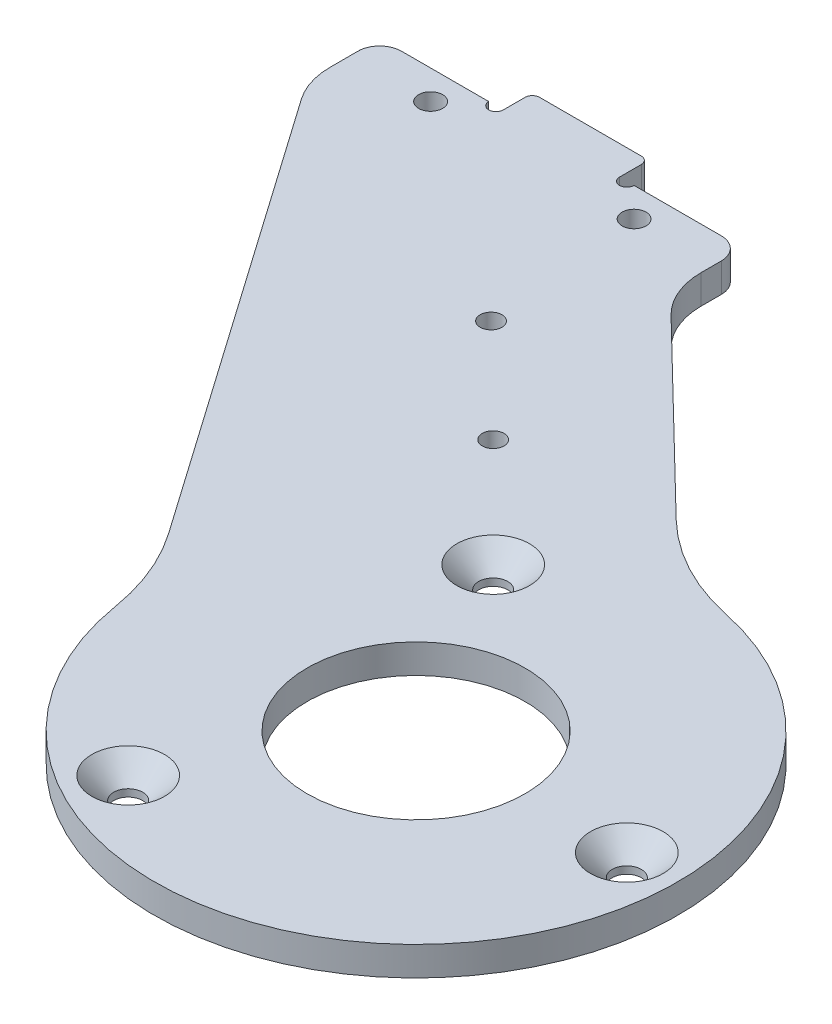
ISO-10303-21;
HEADER;
FILE_DESCRIPTION(('STEP AP214'),'2;1');
FILE_NAME('part.step','',(''),(''),'','','');
FILE_SCHEMA(('AUTOMOTIVE_DESIGN { 1 0 10303 214 1 1 1 1 }'));
ENDSEC;
DATA;
#1=APPLICATION_CONTEXT('core data for automotive mechanical design processes');
#2=APPLICATION_PROTOCOL_DEFINITION('international standard','automotive_design',2000,#1);
#3=PRODUCT_CONTEXT('',#1,'mechanical');
#4=PRODUCT('Part','Part','',(#3));
#5=PRODUCT_RELATED_PRODUCT_CATEGORY('part','',(#4));
#6=PRODUCT_DEFINITION_FORMATION('','',#4);
#7=PRODUCT_DEFINITION_CONTEXT('part definition',#1,'design');
#8=PRODUCT_DEFINITION('design','',#6,#7);
#9=PRODUCT_DEFINITION_SHAPE('','',#8);
#10=(LENGTH_UNIT() NAMED_UNIT(*) SI_UNIT(.MILLI.,.METRE.));
#11=(NAMED_UNIT(*) PLANE_ANGLE_UNIT() SI_UNIT($,.RADIAN.));
#12=(NAMED_UNIT(*) SI_UNIT($,.STERADIAN.) SOLID_ANGLE_UNIT());
#13=UNCERTAINTY_MEASURE_WITH_UNIT(LENGTH_MEASURE(1.E-05),#10,'distance_accuracy_value','');
#14=(GEOMETRIC_REPRESENTATION_CONTEXT(3) GLOBAL_UNCERTAINTY_ASSIGNED_CONTEXT((#13)) GLOBAL_UNIT_ASSIGNED_CONTEXT((#10,
#11,#12)) REPRESENTATION_CONTEXT('',''));
#15=CARTESIAN_POINT('',(0.,0.,0.));
#16=DIRECTION('',(0.,0.,1.));
#17=DIRECTION('',(1.,0.,0.));
#18=AXIS2_PLACEMENT_3D('',#15,#16,#17);
#19=CARTESIAN_POINT('',(-85.,4.,-80.));
#20=DIRECTION('',(0.,0.,1.));
#21=DIRECTION('',(1.,0.,0.));
#22=AXIS2_PLACEMENT_3D('',#19,#20,#21);
#23=PLANE('',#22);
#24=DIRECTION('',(-1.,0.,0.));
#25=VECTOR('',#24,1.);
#26=CARTESIAN_POINT('',(-85.,0.,-80.));
#27=LINE('',#26,#25);
#28=CARTESIAN_POINT('',(-38.,0.,-80.));
#29=VERTEX_POINT('',#28);
#30=CARTESIAN_POINT('',(-50.,0.,-80.));
#31=VERTEX_POINT('',#30);
#32=EDGE_CURVE('E199',#29,#31,#27,.T.);
#33=ORIENTED_EDGE('',*,*,#32,.T.);
#34=DIRECTION('',(0.,1.,0.));
#35=VECTOR('',#34,1.);
#36=CARTESIAN_POINT('',(-50.,0.,-80.));
#37=LINE('',#36,#35);
#38=CARTESIAN_POINT('',(-50.,4.,-80.));
#39=VERTEX_POINT('',#38);
#40=EDGE_CURVE('E183',#31,#39,#37,.T.);
#41=ORIENTED_EDGE('',*,*,#40,.T.);
#42=DIRECTION('',(-1.,0.,0.));
#43=VECTOR('',#42,1.);
#44=CARTESIAN_POINT('',(-85.,4.,-80.));
#45=LINE('',#44,#43);
#46=CARTESIAN_POINT('',(-38.,4.,-80.));
#47=VERTEX_POINT('',#46);
#48=EDGE_CURVE('E223',#47,#39,#45,.T.);
#49=ORIENTED_EDGE('',*,*,#48,.F.);
#50=DIRECTION('',(0.,-1.,0.));
#51=VECTOR('',#50,1.);
#52=CARTESIAN_POINT('',(-38.,4.,-80.));
#53=LINE('',#52,#51);
#54=EDGE_CURVE('E205',#47,#29,#53,.T.);
#55=ORIENTED_EDGE('',*,*,#54,.T.);
#56=EDGE_LOOP('',(#33,#41,#49,#55));
#57=FACE_BOUND('',#56,.T.);
#58=ADVANCED_FACE('F40',(#57),#23,.F.);
#59=CARTESIAN_POINT('',(-85.,4.,-80.));
#60=DIRECTION('',(1.,0.,0.));
#61=DIRECTION('',(0.,0.,-1.));
#62=AXIS2_PLACEMENT_3D('',#59,#60,#61);
#63=PLANE('',#62);
#64=DIRECTION('',(0.,0.,1.));
#65=VECTOR('',#64,1.);
#66=CARTESIAN_POINT('',(-85.,4.,-80.));
#67=LINE('',#66,#65);
#68=CARTESIAN_POINT('',(-85.,4.,-77.));
#69=VERTEX_POINT('',#68);
#70=CARTESIAN_POINT('',(-85.,4.,-73.152222308191));
#71=VERTEX_POINT('',#70);
#72=EDGE_CURVE('E207',#69,#71,#67,.T.);
#73=ORIENTED_EDGE('',*,*,#72,.F.);
#74=DIRECTION('',(0.,-1.,0.));
#75=VECTOR('',#74,1.);
#76=CARTESIAN_POINT('',(-85.,4.,-77.));
#77=LINE('',#76,#75);
#78=CARTESIAN_POINT('',(-85.,0.,-77.));
#79=VERTEX_POINT('',#78);
#80=EDGE_CURVE('E277',#69,#79,#77,.T.);
#81=ORIENTED_EDGE('',*,*,#80,.T.);
#82=DIRECTION('',(0.,0.,1.));
#83=VECTOR('',#82,1.);
#84=CARTESIAN_POINT('',(-85.,0.,-80.));
#85=LINE('',#84,#83);
#86=CARTESIAN_POINT('',(-85.,0.,-73.152222308191));
#87=VERTEX_POINT('',#86);
#88=EDGE_CURVE('E427',#79,#87,#85,.T.);
#89=ORIENTED_EDGE('',*,*,#88,.T.);
#90=DIRECTION('',(0.,-1.,0.));
#91=VECTOR('',#90,1.);
#92=CARTESIAN_POINT('',(-85.,4.,-73.152222308191));
#93=LINE('',#92,#91);
#94=EDGE_CURVE('E257',#87,#71,#93,.F.);
#95=ORIENTED_EDGE('',*,*,#94,.T.);
#96=EDGE_LOOP('',(#73,#81,#89,#95));
#97=FACE_BOUND('',#96,.T.);
#98=ADVANCED_FACE('F511',(#97),#63,.F.);
#99=CARTESIAN_POINT('',(-85.,4.,-70.));
#100=DIRECTION('',(0.81923192051904,0.,-0.573462344363329));
#101=DIRECTION('',(-0.573462344363329,0.,-0.81923192051904));
#102=AXIS2_PLACEMENT_3D('',#99,#100,#101);
#103=PLANE('',#102);
#104=DIRECTION('',(0.573462344363329,0.,0.81923192051904));
#105=VECTOR('',#104,1.);
#106=CARTESIAN_POINT('',(-85.,4.,-70.));
#107=LINE('',#106,#105);
#108=CARTESIAN_POINT('',(-83.1923192051904,4.,-67.4175988645577));
#109=VERTEX_POINT('',#108);
#110=CARTESIAN_POINT('',(-40.5490624094028,4.,-6.49866058486115));
#111=VERTEX_POINT('',#110);
#112=EDGE_CURVE('E212',#109,#111,#107,.T.);
#113=ORIENTED_EDGE('',*,*,#112,.F.);
#114=DIRECTION('',(0.,-1.,0.));
#115=VECTOR('',#114,1.);
#116=CARTESIAN_POINT('',(-83.1923192051904,4.,-67.4175988645577));
#117=LINE('',#116,#115);
#118=CARTESIAN_POINT('',(-83.1923192051904,0.,-67.4175988645577));
#119=VERTEX_POINT('',#118);
#120=EDGE_CURVE('E249',#109,#119,#117,.T.);
#121=ORIENTED_EDGE('',*,*,#120,.T.);
#122=DIRECTION('',(0.573462344363329,0.,0.81923192051904));
#123=VECTOR('',#122,1.);
#124=CARTESIAN_POINT('',(-85.,0.,-70.));
#125=LINE('',#124,#123);
#126=CARTESIAN_POINT('',(-40.5490624094028,0.,-6.49866058486115));
#127=VERTEX_POINT('',#126);
#128=EDGE_CURVE('E457',#119,#127,#125,.T.);
#129=ORIENTED_EDGE('',*,*,#128,.T.);
#130=DIRECTION('',(0.,1.,0.));
#131=VECTOR('',#130,1.);
#132=CARTESIAN_POINT('',(-40.5490624094028,4.,-6.49866058486117));
#133=LINE('',#132,#131);
#134=EDGE_CURVE('E238',#127,#111,#133,.T.);
#135=ORIENTED_EDGE('',*,*,#134,.T.);
#136=EDGE_LOOP('',(#113,#121,#129,#135));
#137=FACE_BOUND('',#136,.T.);
#138=ADVANCED_FACE('F504',(#137),#103,.F.);
#139=CARTESIAN_POINT('',(0.,4.,0.));
#140=DIRECTION('',(0.,-1.,0.));
#141=DIRECTION('',(0.,0.,-1.));
#142=AXIS2_PLACEMENT_3D('',#139,#140,#141);
#143=CYLINDRICAL_SURFACE('',#142,36.);
#144=CARTESIAN_POINT('',(0.,4.,0.));
#145=DIRECTION('',(0.,1.,0.));
#146=DIRECTION('',(0.,0.,1.));
#147=AXIS2_PLACEMENT_3D('',#144,#145,#146);
#148=CIRCLE('',#147,36.);
#149=CARTESIAN_POINT('',(-35.5232836499858,4.,5.83920531602111));
#150=VERTEX_POINT('',#149);
#151=CARTESIAN_POINT('',(7.43947496595859,4.,-35.2229216878849));
#152=VERTEX_POINT('',#151);
#153=EDGE_CURVE('E441',#150,#152,#148,.T.);
#154=ORIENTED_EDGE('',*,*,#153,.F.);
#155=DIRECTION('',(0.,-1.,0.));
#156=VECTOR('',#155,1.);
#157=CARTESIAN_POINT('',(-35.5232836499858,4.,5.83920531602111));
#158=LINE('',#157,#156);
#159=CARTESIAN_POINT('',(-35.5232836499858,0.,5.83920531602111));
#160=VERTEX_POINT('',#159);
#161=EDGE_CURVE('E234',#150,#160,#158,.T.);
#162=ORIENTED_EDGE('',*,*,#161,.T.);
#163=CARTESIAN_POINT('',(0.,0.,0.));
#164=DIRECTION('',(0.,1.,0.));
#165=DIRECTION('',(0.,0.,1.));
#166=AXIS2_PLACEMENT_3D('',#163,#164,#165);
#167=CIRCLE('',#166,36.);
#168=CARTESIAN_POINT('',(7.43947496595859,0.,-35.2229216878849));
#169=VERTEX_POINT('',#168);
#170=EDGE_CURVE('E460',#160,#169,#167,.T.);
#171=ORIENTED_EDGE('',*,*,#170,.T.);
#172=DIRECTION('',(0.,-1.,0.));
#173=VECTOR('',#172,1.);
#174=CARTESIAN_POINT('',(7.43947496595859,4.,-35.2229216878849));
#175=LINE('',#174,#173);
#176=EDGE_CURVE('E222',#169,#152,#175,.F.);
#177=ORIENTED_EDGE('',*,*,#176,.T.);
#178=EDGE_LOOP('',(#154,#162,#171,#177));
#179=FACE_BOUND('',#178,.T.);
#180=ADVANCED_FACE('F493',(#179),#143,.T.);
#181=CARTESIAN_POINT('',(0.,4.,-36.));
#182=DIRECTION('',(-0.696785684263249,0.,0.717279380859227));
#183=DIRECTION('',(0.717279380859227,0.,0.696785684263249));
#184=AXIS2_PLACEMENT_3D('',#181,#182,#183);
#185=PLANE('',#184);
#186=DIRECTION('',(-0.717279380859227,0.,-0.696785684263249));
#187=VECTOR('',#186,1.);
#188=CARTESIAN_POINT('',(0.,0.,-36.));
#189=LINE('',#188,#187);
#190=CARTESIAN_POINT('',(-7.26453309030673,0.,-43.0569750020123));
#191=VERTEX_POINT('',#190);
#192=CARTESIAN_POINT('',(-31.9678568426325,0.,-67.0544895042715));
#193=VERTEX_POINT('',#192);
#194=EDGE_CURVE('E462',#191,#193,#189,.T.);
#195=ORIENTED_EDGE('',*,*,#194,.T.);
#196=DIRECTION('',(0.,-1.,0.));
#197=VECTOR('',#196,1.);
#198=CARTESIAN_POINT('',(-31.9678568426325,4.,-67.0544895042715));
#199=LINE('',#198,#197);
#200=CARTESIAN_POINT('',(-31.9678568426325,4.,-67.0544895042715));
#201=VERTEX_POINT('',#200);
#202=EDGE_CURVE('E268',#193,#201,#199,.F.);
#203=ORIENTED_EDGE('',*,*,#202,.T.);
#204=DIRECTION('',(-0.717279380859227,0.,-0.696785684263249));
#205=VECTOR('',#204,1.);
#206=CARTESIAN_POINT('',(0.,4.,-36.));
#207=LINE('',#206,#205);
#208=CARTESIAN_POINT('',(-7.26453309030673,4.,-43.0569750020123));
#209=VERTEX_POINT('',#208);
#210=EDGE_CURVE('E444',#209,#201,#207,.T.);
#211=ORIENTED_EDGE('',*,*,#210,.F.);
#212=DIRECTION('',(0.,1.,0.));
#213=VECTOR('',#212,1.);
#214=CARTESIAN_POINT('',(-7.26453309030673,0.,-43.0569750020123));
#215=LINE('',#214,#213);
#216=EDGE_CURVE('E218',#209,#191,#215,.F.);
#217=ORIENTED_EDGE('',*,*,#216,.T.);
#218=EDGE_LOOP('',(#195,#203,#211,#217));
#219=FACE_BOUND('',#218,.T.);
#220=ADVANCED_FACE('F567',(#219),#185,.F.);
#221=CARTESIAN_POINT('',(-35.,4.,-80.));
#222=DIRECTION('',(-1.,0.,0.));
#223=DIRECTION('',(0.,0.,1.));
#224=AXIS2_PLACEMENT_3D('',#221,#222,#223);
#225=PLANE('',#224);
#226=DIRECTION('',(0.,0.,-1.));
#227=VECTOR('',#226,1.);
#228=CARTESIAN_POINT('',(-35.,0.,-80.));
#229=LINE('',#228,#227);
#230=CARTESIAN_POINT('',(-35.,0.,-74.2272833128638));
#231=VERTEX_POINT('',#230);
#232=CARTESIAN_POINT('',(-35.,0.,-77.));
#233=VERTEX_POINT('',#232);
#234=EDGE_CURVE('E214',#231,#233,#229,.T.);
#235=ORIENTED_EDGE('',*,*,#234,.T.);
#236=DIRECTION('',(0.,-1.,0.));
#237=VECTOR('',#236,1.);
#238=CARTESIAN_POINT('',(-35.,4.,-77.));
#239=LINE('',#238,#237);
#240=CARTESIAN_POINT('',(-35.,4.,-77.));
#241=VERTEX_POINT('',#240);
#242=EDGE_CURVE('E300',#233,#241,#239,.F.);
#243=ORIENTED_EDGE('',*,*,#242,.T.);
#244=DIRECTION('',(0.,0.,-1.));
#245=VECTOR('',#244,1.);
#246=CARTESIAN_POINT('',(-35.,4.,-80.));
#247=LINE('',#246,#245);
#248=CARTESIAN_POINT('',(-35.,4.,-74.2272833128638));
#249=VERTEX_POINT('',#248);
#250=EDGE_CURVE('E448',#249,#241,#247,.T.);
#251=ORIENTED_EDGE('',*,*,#250,.F.);
#252=DIRECTION('',(0.,-1.,0.));
#253=VECTOR('',#252,1.);
#254=CARTESIAN_POINT('',(-35.,0.,-74.2272833128638));
#255=LINE('',#254,#253);
#256=EDGE_CURVE('E264',#249,#231,#255,.T.);
#257=ORIENTED_EDGE('',*,*,#256,.T.);
#258=EDGE_LOOP('',(#235,#243,#251,#257));
#259=FACE_BOUND('',#258,.T.);
#260=ADVANCED_FACE('F473',(#259),#225,.F.);
#261=CARTESIAN_POINT('',(-70.,4.,-80.));
#262=VERTEX_POINT('',#261);
#263=CARTESIAN_POINT('',(-82.,4.,-80.));
#264=VERTEX_POINT('',#263);
#265=EDGE_CURVE('E452',#262,#264,#45,.T.);
#266=ORIENTED_EDGE('',*,*,#265,.F.);
#267=DIRECTION('',(0.,1.,0.));
#268=VECTOR('',#267,1.);
#269=CARTESIAN_POINT('',(-70.,0.,-80.));
#270=LINE('',#269,#268);
#271=CARTESIAN_POINT('',(-70.,0.,-80.));
#272=VERTEX_POINT('',#271);
#273=EDGE_CURVE('E385',#272,#262,#270,.T.);
#274=ORIENTED_EDGE('',*,*,#273,.F.);
#275=CARTESIAN_POINT('',(-82.,0.,-80.));
#276=VERTEX_POINT('',#275);
#277=EDGE_CURVE('E208',#272,#276,#27,.T.);
#278=ORIENTED_EDGE('',*,*,#277,.T.);
#279=DIRECTION('',(0.,-1.,0.));
#280=VECTOR('',#279,1.);
#281=CARTESIAN_POINT('',(-82.,4.,-80.));
#282=LINE('',#281,#280);
#283=EDGE_CURVE('E290',#276,#264,#282,.F.);
#284=ORIENTED_EDGE('',*,*,#283,.T.);
#285=EDGE_LOOP('',(#266,#274,#278,#284));
#286=FACE_BOUND('',#285,.T.);
#287=ADVANCED_FACE('F520',(#286),#23,.F.);
#288=CARTESIAN_POINT('',(0.,4.,0.));
#289=DIRECTION('',(0.,1.,0.));
#290=DIRECTION('',(0.,0.,1.));
#291=AXIS2_PLACEMENT_3D('',#288,#289,#290);
#292=PLANE('',#291);
#293=CARTESIAN_POINT('',(-43.6868805879241,4.,-54.0042263577252));
#294=DIRECTION('',(0.,1.,0.));
#295=DIRECTION('',(0.,0.,1.));
#296=AXIS2_PLACEMENT_3D('',#293,#294,#295);
#297=CIRCLE('',#296,1.5);
#298=CARTESIAN_POINT('',(-43.6868805879241,4.,-52.5042263577252));
#299=VERTEX_POINT('',#298);
#300=EDGE_CURVE('E354',#299,#299,#297,.T.);
#301=ORIENTED_EDGE('',*,*,#300,.F.);
#302=EDGE_LOOP('',(#301));
#303=FACE_BOUND('',#302,.T.);
#304=CARTESIAN_POINT('',(-29.4011663022099,4.,-40.0071421132499));
#305=DIRECTION('',(0.,1.,0.));
#306=DIRECTION('',(0.,0.,1.));
#307=AXIS2_PLACEMENT_3D('',#304,#305,#306);
#308=CIRCLE('',#307,1.5);
#309=CARTESIAN_POINT('',(-29.4011663022099,4.,-38.5071421132499));
#310=VERTEX_POINT('',#309);
#311=EDGE_CURVE('E362',#310,#310,#308,.T.);
#312=ORIENTED_EDGE('',*,*,#311,.F.);
#313=EDGE_LOOP('',(#312));
#314=FACE_BOUND('',#313,.T.);
#315=CARTESIAN_POINT('',(-14.4999999999998,4.,25.1147367097489));
#316=DIRECTION('',(0.,1.,0.));
#317=DIRECTION('',(0.,0.,1.));
#318=AXIS2_PLACEMENT_3D('',#315,#316,#317);
#319=CIRCLE('',#318,4.99999999999999);
#320=CARTESIAN_POINT('',(-14.4999999999998,4.,30.1147367097488));
#321=VERTEX_POINT('',#320);
#322=EDGE_CURVE('E345',#321,#321,#319,.F.);
#323=ORIENTED_EDGE('',*,*,#322,.T.);
#324=EDGE_LOOP('',(#323));
#325=FACE_BOUND('',#324,.T.);
#326=CARTESIAN_POINT('',(29.,4.,0.));
#327=DIRECTION('',(0.,1.,0.));
#328=DIRECTION('',(0.,0.,1.));
#329=AXIS2_PLACEMENT_3D('',#326,#327,#328);
#330=CIRCLE('',#329,4.99999999999999);
#331=CARTESIAN_POINT('',(29.,4.,4.99999999999999));
#332=VERTEX_POINT('',#331);
#333=EDGE_CURVE('E341',#332,#332,#330,.F.);
#334=ORIENTED_EDGE('',*,*,#333,.T.);
#335=EDGE_LOOP('',(#334));
#336=FACE_BOUND('',#335,.T.);
#337=CARTESIAN_POINT('',(-14.5000000000001,4.,-25.1147367097486));
#338=DIRECTION('',(0.,1.,0.));
#339=DIRECTION('',(0.,0.,1.));
#340=AXIS2_PLACEMENT_3D('',#337,#338,#339);
#341=CIRCLE('',#340,4.99999999999999);
#342=CARTESIAN_POINT('',(-14.5000000000001,4.,-20.1147367097487));
#343=VERTEX_POINT('',#342);
#344=EDGE_CURVE('E337',#343,#343,#341,.F.);
#345=ORIENTED_EDGE('',*,*,#344,.T.);
#346=EDGE_LOOP('',(#345));
#347=FACE_BOUND('',#346,.T.);
#348=CARTESIAN_POINT('',(0.,4.,0.));
#349=DIRECTION('',(0.,1.,0.));
#350=DIRECTION('',(0.,0.,1.));
#351=AXIS2_PLACEMENT_3D('',#348,#349,#350);
#352=CIRCLE('',#351,15.);
#353=CARTESIAN_POINT('',(0.,4.,15.));
#354=VERTEX_POINT('',#353);
#355=EDGE_CURVE('E333',#354,#354,#352,.T.);
#356=ORIENTED_EDGE('',*,*,#355,.F.);
#357=EDGE_LOOP('',(#356));
#358=FACE_BOUND('',#357,.T.);
#359=DIRECTION('',(-1.,0.,0.));
#360=VECTOR('',#359,1.);
#361=CARTESIAN_POINT('',(-68.,4.,-84.));
#362=LINE('',#361,#360);
#363=CARTESIAN_POINT('',(-53.,4.,-84.));
#364=VERTEX_POINT('',#363);
#365=CARTESIAN_POINT('',(-67.,4.,-84.));
#366=VERTEX_POINT('',#365);
#367=EDGE_CURVE('E410',#364,#366,#362,.T.);
#368=ORIENTED_EDGE('',*,*,#367,.T.);
#369=CARTESIAN_POINT('',(-67.,4.,-83.));
#370=DIRECTION('',(0.,1.,0.));
#371=DIRECTION('',(0.,0.,1.));
#372=AXIS2_PLACEMENT_3D('',#369,#370,#371);
#373=CIRCLE('',#372,1.);
#374=CARTESIAN_POINT('',(-68.,4.,-83.));
#375=VERTEX_POINT('',#374);
#376=EDGE_CURVE('E313',#366,#375,#373,.T.);
#377=ORIENTED_EDGE('',*,*,#376,.T.);
#378=DIRECTION('',(0.,0.,1.));
#379=VECTOR('',#378,1.);
#380=CARTESIAN_POINT('',(-68.,4.,-84.));
#381=LINE('',#380,#379);
#382=CARTESIAN_POINT('',(-68.,4.,-80.));
#383=VERTEX_POINT('',#382);
#384=EDGE_CURVE('E399',#375,#383,#381,.T.);
#385=ORIENTED_EDGE('',*,*,#384,.T.);
#386=CARTESIAN_POINT('',(-69.,4.,-80.));
#387=DIRECTION('',(0.,1.,0.));
#388=DIRECTION('',(0.,0.,-1.));
#389=AXIS2_PLACEMENT_3D('',#386,#387,#388);
#390=CIRCLE('',#389,1.);
#391=EDGE_CURVE('E332',#262,#383,#390,.T.);
#392=ORIENTED_EDGE('',*,*,#391,.F.);
#393=ORIENTED_EDGE('',*,*,#265,.T.);
#394=CARTESIAN_POINT('',(-82.,4.,-77.));
#395=DIRECTION('',(0.,1.,0.));
#396=DIRECTION('',(0.,0.,1.));
#397=AXIS2_PLACEMENT_3D('',#394,#395,#396);
#398=CIRCLE('',#397,3.);
#399=EDGE_CURVE('E297',#264,#69,#398,.T.);
#400=ORIENTED_EDGE('',*,*,#399,.T.);
#401=ORIENTED_EDGE('',*,*,#72,.T.);
#402=CARTESIAN_POINT('',(-75.,4.,-73.152222308191));
#403=DIRECTION('',(0.,1.,0.));
#404=DIRECTION('',(0.,0.,1.));
#405=AXIS2_PLACEMENT_3D('',#402,#403,#404);
#406=CIRCLE('',#405,10.);
#407=EDGE_CURVE('E261',#71,#109,#406,.T.);
#408=ORIENTED_EDGE('',*,*,#407,.T.);
#409=ORIENTED_EDGE('',*,*,#112,.T.);
#410=CARTESIAN_POINT('',(-65.126020024974,4.,10.7052097460387));
#411=DIRECTION('',(0.,1.,0.));
#412=DIRECTION('',(0.,0.,1.));
#413=AXIS2_PLACEMENT_3D('',#410,#411,#412);
#414=CIRCLE('',#413,30.);
#415=EDGE_CURVE('E246',#111,#150,#414,.F.);
#416=ORIENTED_EDGE('',*,*,#415,.T.);
#417=ORIENTED_EDGE('',*,*,#153,.T.);
#418=CARTESIAN_POINT('',(13.6390374375907,4.,-64.5753564277891));
#419=DIRECTION('',(0.,1.,0.));
#420=DIRECTION('',(0.,0.,1.));
#421=AXIS2_PLACEMENT_3D('',#418,#419,#420);
#422=CIRCLE('',#421,30.);
#423=EDGE_CURVE('E231',#152,#209,#422,.F.);
#424=ORIENTED_EDGE('',*,*,#423,.T.);
#425=ORIENTED_EDGE('',*,*,#210,.T.);
#426=CARTESIAN_POINT('',(-25.,4.,-74.2272833128638));
#427=DIRECTION('',(0.,1.,0.));
#428=DIRECTION('',(0.,0.,1.));
#429=AXIS2_PLACEMENT_3D('',#426,#427,#428);
#430=CIRCLE('',#429,10.);
#431=EDGE_CURVE('E274',#201,#249,#430,.F.);
#432=ORIENTED_EDGE('',*,*,#431,.T.);
#433=ORIENTED_EDGE('',*,*,#250,.T.);
#434=CARTESIAN_POINT('',(-38.,4.,-77.));
#435=DIRECTION('',(0.,1.,0.));
#436=DIRECTION('',(0.,0.,1.));
#437=AXIS2_PLACEMENT_3D('',#434,#435,#436);
#438=CIRCLE('',#437,3.);
#439=EDGE_CURVE('E294',#241,#47,#438,.T.);
#440=ORIENTED_EDGE('',*,*,#439,.T.);
#441=ORIENTED_EDGE('',*,*,#48,.T.);
#442=CARTESIAN_POINT('',(-51.,4.,-80.));
#443=DIRECTION('',(0.,1.,0.));
#444=DIRECTION('',(0.,0.,1.));
#445=AXIS2_PLACEMENT_3D('',#442,#443,#444);
#446=CIRCLE('',#445,1.);
#447=CARTESIAN_POINT('',(-52.,4.,-80.));
#448=VERTEX_POINT('',#447);
#449=EDGE_CURVE('E189',#448,#39,#446,.T.);
#450=ORIENTED_EDGE('',*,*,#449,.F.);
#451=DIRECTION('',(0.,0.,-1.));
#452=VECTOR('',#451,1.);
#453=CARTESIAN_POINT('',(-52.,4.,-84.));
#454=LINE('',#453,#452);
#455=CARTESIAN_POINT('',(-52.,4.,-83.));
#456=VERTEX_POINT('',#455);
#457=EDGE_CURVE('E195',#448,#456,#454,.T.);
#458=ORIENTED_EDGE('',*,*,#457,.T.);
#459=CARTESIAN_POINT('',(-53.,4.,-83.));
#460=DIRECTION('',(0.,1.,0.));
#461=DIRECTION('',(0.,0.,1.));
#462=AXIS2_PLACEMENT_3D('',#459,#460,#461);
#463=CIRCLE('',#462,1.);
#464=EDGE_CURVE('E310',#456,#364,#463,.T.);
#465=ORIENTED_EDGE('',*,*,#464,.T.);
#466=EDGE_LOOP('',(#368,#377,#385,#392,#393,#400,#401,#408,#409,#416,#417,#424,#425,#432,#433,
#440,#441,#450,#458,#465));
#467=FACE_BOUND('',#466,.T.);
#468=CARTESIAN_POINT('',(-46.,4.,-76.));
#469=DIRECTION('',(0.,1.,0.));
#470=DIRECTION('',(0.,0.,1.));
#471=AXIS2_PLACEMENT_3D('',#468,#469,#470);
#472=CIRCLE('',#471,1.65);
#473=CARTESIAN_POINT('',(-46.,4.,-74.35));
#474=VERTEX_POINT('',#473);
#475=EDGE_CURVE('E428',#474,#474,#472,.T.);
#476=ORIENTED_EDGE('',*,*,#475,.F.);
#477=EDGE_LOOP('',(#476));
#478=FACE_BOUND('',#477,.T.);
#479=CARTESIAN_POINT('',(-74.,4.,-76.));
#480=DIRECTION('',(0.,1.,0.));
#481=DIRECTION('',(0.,0.,-1.));
#482=AXIS2_PLACEMENT_3D('',#479,#480,#481);
#483=CIRCLE('',#482,1.65);
#484=CARTESIAN_POINT('',(-74.,4.,-77.65));
#485=VERTEX_POINT('',#484);
#486=EDGE_CURVE('E419',#485,#485,#483,.T.);
#487=ORIENTED_EDGE('',*,*,#486,.F.);
#488=EDGE_LOOP('',(#487));
#489=FACE_BOUND('',#488,.T.);
#490=ADVANCED_FACE('F480',(#303,#314,#325,#336,#347,#358,#467,#478,#489),#292,.T.);
#491=CARTESIAN_POINT('',(0.,0.,0.));
#492=DIRECTION('',(0.,1.,0.));
#493=DIRECTION('',(0.,0.,1.));
#494=AXIS2_PLACEMENT_3D('',#491,#492,#493);
#495=PLANE('',#494);
#496=CARTESIAN_POINT('',(-43.6868805879241,0.,-54.0042263577252));
#497=DIRECTION('',(0.,1.,0.));
#498=DIRECTION('',(0.,0.,1.));
#499=AXIS2_PLACEMENT_3D('',#496,#497,#498);
#500=CIRCLE('',#499,1.5);
#501=CARTESIAN_POINT('',(-43.6868805879241,0.,-52.5042263577252));
#502=VERTEX_POINT('',#501);
#503=EDGE_CURVE('E45',#502,#502,#500,.T.);
#504=ORIENTED_EDGE('',*,*,#503,.T.);
#505=EDGE_LOOP('',(#504));
#506=FACE_BOUND('',#505,.T.);
#507=CARTESIAN_POINT('',(-29.4011663022099,0.,-40.0071421132499));
#508=DIRECTION('',(0.,1.,0.));
#509=DIRECTION('',(0.,0.,1.));
#510=AXIS2_PLACEMENT_3D('',#507,#508,#509);
#511=CIRCLE('',#510,1.5);
#512=CARTESIAN_POINT('',(-29.4011663022099,0.,-38.5071421132499));
#513=VERTEX_POINT('',#512);
#514=EDGE_CURVE('E351',#513,#513,#511,.T.);
#515=ORIENTED_EDGE('',*,*,#514,.T.);
#516=EDGE_LOOP('',(#515));
#517=FACE_BOUND('',#516,.T.);
#518=CARTESIAN_POINT('',(29.,0.,0.));
#519=DIRECTION('',(0.,-1.,0.));
#520=DIRECTION('',(0.,0.,-1.));
#521=AXIS2_PLACEMENT_3D('',#518,#519,#520);
#522=CIRCLE('',#521,2.);
#523=CARTESIAN_POINT('',(29.,0.,-2.));
#524=VERTEX_POINT('',#523);
#525=EDGE_CURVE('E370',#524,#524,#522,.T.);
#526=ORIENTED_EDGE('',*,*,#525,.F.);
#527=EDGE_LOOP('',(#526));
#528=FACE_BOUND('',#527,.T.);
#529=CARTESIAN_POINT('',(-14.5000000000001,0.,-25.1147367097486));
#530=DIRECTION('',(0.,-1.,0.));
#531=DIRECTION('',(0.,0.,-1.));
#532=AXIS2_PLACEMENT_3D('',#529,#530,#531);
#533=CIRCLE('',#532,2.);
#534=CARTESIAN_POINT('',(-14.5000000000001,0.,-27.1147367097486));
#535=VERTEX_POINT('',#534);
#536=EDGE_CURVE('E374',#535,#535,#533,.T.);
#537=ORIENTED_EDGE('',*,*,#536,.F.);
#538=EDGE_LOOP('',(#537));
#539=FACE_BOUND('',#538,.T.);
#540=CARTESIAN_POINT('',(-14.4999999999998,0.,25.1147367097489));
#541=DIRECTION('',(0.,-1.,0.));
#542=DIRECTION('',(0.,0.,-1.));
#543=AXIS2_PLACEMENT_3D('',#540,#541,#542);
#544=CIRCLE('',#543,2.);
#545=CARTESIAN_POINT('',(-14.4999999999998,0.,23.1147367097489));
#546=VERTEX_POINT('',#545);
#547=EDGE_CURVE('E360',#546,#546,#544,.T.);
#548=ORIENTED_EDGE('',*,*,#547,.F.);
#549=EDGE_LOOP('',(#548));
#550=FACE_BOUND('',#549,.T.);
#551=CARTESIAN_POINT('',(0.,0.,0.));
#552=DIRECTION('',(0.,1.,0.));
#553=DIRECTION('',(0.,0.,1.));
#554=AXIS2_PLACEMENT_3D('',#551,#552,#553);
#555=CIRCLE('',#554,15.);
#556=CARTESIAN_POINT('',(0.,0.,15.));
#557=VERTEX_POINT('',#556);
#558=EDGE_CURVE('E328',#557,#557,#555,.T.);
#559=ORIENTED_EDGE('',*,*,#558,.T.);
#560=EDGE_LOOP('',(#559));
#561=FACE_BOUND('',#560,.T.);
#562=CARTESIAN_POINT('',(-46.,0.,-76.));
#563=DIRECTION('',(0.,1.,0.));
#564=DIRECTION('',(0.,0.,1.));
#565=AXIS2_PLACEMENT_3D('',#562,#563,#564);
#566=CIRCLE('',#565,1.65);
#567=CARTESIAN_POINT('',(-46.,0.,-74.35));
#568=VERTEX_POINT('',#567);
#569=EDGE_CURVE('E423',#568,#568,#566,.T.);
#570=ORIENTED_EDGE('',*,*,#569,.T.);
#571=EDGE_LOOP('',(#570));
#572=FACE_BOUND('',#571,.T.);
#573=CARTESIAN_POINT('',(-74.,0.,-76.));
#574=DIRECTION('',(0.,1.,0.));
#575=DIRECTION('',(0.,0.,-1.));
#576=AXIS2_PLACEMENT_3D('',#573,#574,#575);
#577=CIRCLE('',#576,1.65);
#578=CARTESIAN_POINT('',(-74.,0.,-77.65));
#579=VERTEX_POINT('',#578);
#580=EDGE_CURVE('E432',#579,#579,#577,.T.);
#581=ORIENTED_EDGE('',*,*,#580,.T.);
#582=EDGE_LOOP('',(#581));
#583=FACE_BOUND('',#582,.T.);
#584=DIRECTION('',(0.,0.,1.));
#585=VECTOR('',#584,1.);
#586=CARTESIAN_POINT('',(-68.,0.,-84.));
#587=LINE('',#586,#585);
#588=CARTESIAN_POINT('',(-68.,0.,-83.));
#589=VERTEX_POINT('',#588);
#590=CARTESIAN_POINT('',(-68.,0.,-80.));
#591=VERTEX_POINT('',#590);
#592=EDGE_CURVE('E403',#589,#591,#587,.T.);
#593=ORIENTED_EDGE('',*,*,#592,.F.);
#594=CARTESIAN_POINT('',(-67.,0.,-83.));
#595=DIRECTION('',(0.,1.,0.));
#596=DIRECTION('',(0.,0.,1.));
#597=AXIS2_PLACEMENT_3D('',#594,#595,#596);
#598=CIRCLE('',#597,1.);
#599=CARTESIAN_POINT('',(-67.,0.,-84.));
#600=VERTEX_POINT('',#599);
#601=EDGE_CURVE('E320',#589,#600,#598,.F.);
#602=ORIENTED_EDGE('',*,*,#601,.T.);
#603=DIRECTION('',(-1.,0.,0.));
#604=VECTOR('',#603,1.);
#605=CARTESIAN_POINT('',(-68.,0.,-84.));
#606=LINE('',#605,#604);
#607=CARTESIAN_POINT('',(-53.,0.,-84.));
#608=VERTEX_POINT('',#607);
#609=EDGE_CURVE('E398',#608,#600,#606,.T.);
#610=ORIENTED_EDGE('',*,*,#609,.F.);
#611=CARTESIAN_POINT('',(-53.,0.,-83.));
#612=DIRECTION('',(0.,1.,0.));
#613=DIRECTION('',(0.,0.,1.));
#614=AXIS2_PLACEMENT_3D('',#611,#612,#613);
#615=CIRCLE('',#614,1.);
#616=CARTESIAN_POINT('',(-52.,0.,-83.));
#617=VERTEX_POINT('',#616);
#618=EDGE_CURVE('E59',#608,#617,#615,.F.);
#619=ORIENTED_EDGE('',*,*,#618,.T.);
#620=DIRECTION('',(0.,0.,-1.));
#621=VECTOR('',#620,1.);
#622=CARTESIAN_POINT('',(-52.,0.,-84.));
#623=LINE('',#622,#621);
#624=CARTESIAN_POINT('',(-52.,0.,-80.));
#625=VERTEX_POINT('',#624);
#626=EDGE_CURVE('E200',#625,#617,#623,.T.);
#627=ORIENTED_EDGE('',*,*,#626,.F.);
#628=CARTESIAN_POINT('',(-51.,0.,-80.));
#629=DIRECTION('',(0.,1.,0.));
#630=DIRECTION('',(0.,0.,1.));
#631=AXIS2_PLACEMENT_3D('',#628,#629,#630);
#632=CIRCLE('',#631,1.);
#633=EDGE_CURVE('E186',#625,#31,#632,.T.);
#634=ORIENTED_EDGE('',*,*,#633,.T.);
#635=ORIENTED_EDGE('',*,*,#32,.F.);
#636=CARTESIAN_POINT('',(-38.,0.,-77.));
#637=DIRECTION('',(0.,1.,0.));
#638=DIRECTION('',(0.,0.,1.));
#639=AXIS2_PLACEMENT_3D('',#636,#637,#638);
#640=CIRCLE('',#639,3.);
#641=EDGE_CURVE('E281',#29,#233,#640,.F.);
#642=ORIENTED_EDGE('',*,*,#641,.T.);
#643=ORIENTED_EDGE('',*,*,#234,.F.);
#644=CARTESIAN_POINT('',(-25.,0.,-74.2272833128638));
#645=DIRECTION('',(0.,1.,0.));
#646=DIRECTION('',(0.,0.,1.));
#647=AXIS2_PLACEMENT_3D('',#644,#645,#646);
#648=CIRCLE('',#647,10.);
#649=EDGE_CURVE('E271',#231,#193,#648,.T.);
#650=ORIENTED_EDGE('',*,*,#649,.T.);
#651=ORIENTED_EDGE('',*,*,#194,.F.);
#652=CARTESIAN_POINT('',(13.6390374375907,0.,-64.5753564277891));
#653=DIRECTION('',(0.,1.,0.));
#654=DIRECTION('',(0.,0.,1.));
#655=AXIS2_PLACEMENT_3D('',#652,#653,#654);
#656=CIRCLE('',#655,30.);
#657=EDGE_CURVE('E227',#191,#169,#656,.T.);
#658=ORIENTED_EDGE('',*,*,#657,.T.);
#659=ORIENTED_EDGE('',*,*,#170,.F.);
#660=CARTESIAN_POINT('',(-65.126020024974,0.,10.7052097460387));
#661=DIRECTION('',(0.,1.,0.));
#662=DIRECTION('',(0.,0.,1.));
#663=AXIS2_PLACEMENT_3D('',#660,#661,#662);
#664=CIRCLE('',#663,30.);
#665=EDGE_CURVE('E242',#160,#127,#664,.T.);
#666=ORIENTED_EDGE('',*,*,#665,.T.);
#667=ORIENTED_EDGE('',*,*,#128,.F.);
#668=CARTESIAN_POINT('',(-75.,0.,-73.152222308191));
#669=DIRECTION('',(0.,1.,0.));
#670=DIRECTION('',(0.,0.,1.));
#671=AXIS2_PLACEMENT_3D('',#668,#669,#670);
#672=CIRCLE('',#671,10.);
#673=EDGE_CURVE('E253',#119,#87,#672,.F.);
#674=ORIENTED_EDGE('',*,*,#673,.T.);
#675=ORIENTED_EDGE('',*,*,#88,.F.);
#676=CARTESIAN_POINT('',(-82.,0.,-77.));
#677=DIRECTION('',(0.,1.,0.));
#678=DIRECTION('',(0.,0.,1.));
#679=AXIS2_PLACEMENT_3D('',#676,#677,#678);
#680=CIRCLE('',#679,3.);
#681=EDGE_CURVE('E284',#79,#276,#680,.F.);
#682=ORIENTED_EDGE('',*,*,#681,.T.);
#683=ORIENTED_EDGE('',*,*,#277,.F.);
#684=CARTESIAN_POINT('',(-69.,0.,-80.));
#685=DIRECTION('',(0.,1.,0.));
#686=DIRECTION('',(0.,0.,-1.));
#687=AXIS2_PLACEMENT_3D('',#684,#685,#686);
#688=CIRCLE('',#687,1.);
#689=EDGE_CURVE('E387',#272,#591,#688,.T.);
#690=ORIENTED_EDGE('',*,*,#689,.T.);
#691=EDGE_LOOP('',(#593,#602,#610,#619,#627,#634,#635,#642,#643,#650,#651,#658,#659,#666,#667,
#674,#675,#682,#683,#690));
#692=FACE_BOUND('',#691,.T.);
#693=ADVANCED_FACE('F198',(#506,#517,#528,#539,#550,#561,#572,#583,#692),#495,.F.);
#694=CARTESIAN_POINT('',(13.6390374375907,4.,-64.5753564277891));
#695=DIRECTION('',(0.,-1.,0.));
#696=DIRECTION('',(0.,0.,-1.));
#697=AXIS2_PLACEMENT_3D('',#694,#695,#696);
#698=CYLINDRICAL_SURFACE('',#697,30.);
#699=ORIENTED_EDGE('',*,*,#423,.F.);
#700=ORIENTED_EDGE('',*,*,#176,.F.);
#701=ORIENTED_EDGE('',*,*,#657,.F.);
#702=ORIENTED_EDGE('',*,*,#216,.F.);
#703=EDGE_LOOP('',(#699,#700,#701,#702));
#704=FACE_BOUND('',#703,.T.);
#705=ADVANCED_FACE('F490',(#704),#698,.F.);
#706=CARTESIAN_POINT('',(-65.126020024974,4.,10.7052097460387));
#707=DIRECTION('',(0.,-1.,0.));
#708=DIRECTION('',(0.,0.,-1.));
#709=AXIS2_PLACEMENT_3D('',#706,#707,#708);
#710=CYLINDRICAL_SURFACE('',#709,30.);
#711=ORIENTED_EDGE('',*,*,#415,.F.);
#712=ORIENTED_EDGE('',*,*,#134,.F.);
#713=ORIENTED_EDGE('',*,*,#665,.F.);
#714=ORIENTED_EDGE('',*,*,#161,.F.);
#715=EDGE_LOOP('',(#711,#712,#713,#714));
#716=FACE_BOUND('',#715,.T.);
#717=ADVANCED_FACE('F497',(#716),#710,.F.);
#718=CARTESIAN_POINT('',(-74.,0.,-76.));
#719=DIRECTION('',(0.,1.,0.));
#720=DIRECTION('',(0.,0.,1.));
#721=AXIS2_PLACEMENT_3D('',#718,#719,#720);
#722=CYLINDRICAL_SURFACE('',#721,1.65);
#723=ORIENTED_EDGE('',*,*,#580,.F.);
#724=EDGE_LOOP('',(#723));
#725=FACE_BOUND('',#724,.T.);
#726=ORIENTED_EDGE('',*,*,#486,.T.);
#727=EDGE_LOOP('',(#726));
#728=FACE_BOUND('',#727,.T.);
#729=ADVANCED_FACE('F581',(#725,#728),#722,.F.);
#730=CARTESIAN_POINT('',(-46.,0.,-76.));
#731=DIRECTION('',(0.,1.,0.));
#732=DIRECTION('',(0.,0.,1.));
#733=AXIS2_PLACEMENT_3D('',#730,#731,#732);
#734=CYLINDRICAL_SURFACE('',#733,1.65);
#735=ORIENTED_EDGE('',*,*,#569,.F.);
#736=EDGE_LOOP('',(#735));
#737=FACE_BOUND('',#736,.T.);
#738=ORIENTED_EDGE('',*,*,#475,.T.);
#739=EDGE_LOOP('',(#738));
#740=FACE_BOUND('',#739,.T.);
#741=ADVANCED_FACE('F584',(#737,#740),#734,.F.);
#742=CARTESIAN_POINT('',(-75.,4.,-73.152222308191));
#743=DIRECTION('',(0.,-1.,0.));
#744=DIRECTION('',(0.,0.,-1.));
#745=AXIS2_PLACEMENT_3D('',#742,#743,#744);
#746=CYLINDRICAL_SURFACE('',#745,10.);
#747=ORIENTED_EDGE('',*,*,#407,.F.);
#748=ORIENTED_EDGE('',*,*,#94,.F.);
#749=ORIENTED_EDGE('',*,*,#673,.F.);
#750=ORIENTED_EDGE('',*,*,#120,.F.);
#751=EDGE_LOOP('',(#747,#748,#749,#750));
#752=FACE_BOUND('',#751,.T.);
#753=ADVANCED_FACE('F508',(#752),#746,.T.);
#754=CARTESIAN_POINT('',(-25.,4.,-74.2272833128638));
#755=DIRECTION('',(0.,1.,0.));
#756=DIRECTION('',(0.,0.,1.));
#757=AXIS2_PLACEMENT_3D('',#754,#755,#756);
#758=CYLINDRICAL_SURFACE('',#757,10.);
#759=ORIENTED_EDGE('',*,*,#431,.F.);
#760=ORIENTED_EDGE('',*,*,#202,.F.);
#761=ORIENTED_EDGE('',*,*,#649,.F.);
#762=ORIENTED_EDGE('',*,*,#256,.F.);
#763=EDGE_LOOP('',(#759,#760,#761,#762));
#764=FACE_BOUND('',#763,.T.);
#765=ADVANCED_FACE('F484',(#764),#758,.F.);
#766=CARTESIAN_POINT('',(-82.,4.,-77.));
#767=DIRECTION('',(0.,-1.,0.));
#768=DIRECTION('',(0.,0.,-1.));
#769=AXIS2_PLACEMENT_3D('',#766,#767,#768);
#770=CYLINDRICAL_SURFACE('',#769,3.);
#771=ORIENTED_EDGE('',*,*,#399,.F.);
#772=ORIENTED_EDGE('',*,*,#283,.F.);
#773=ORIENTED_EDGE('',*,*,#681,.F.);
#774=ORIENTED_EDGE('',*,*,#80,.F.);
#775=EDGE_LOOP('',(#771,#772,#773,#774));
#776=FACE_BOUND('',#775,.T.);
#777=ADVANCED_FACE('F517',(#776),#770,.T.);
#778=CARTESIAN_POINT('',(-38.,4.,-77.));
#779=DIRECTION('',(0.,-1.,0.));
#780=DIRECTION('',(0.,0.,-1.));
#781=AXIS2_PLACEMENT_3D('',#778,#779,#780);
#782=CYLINDRICAL_SURFACE('',#781,3.);
#783=ORIENTED_EDGE('',*,*,#439,.F.);
#784=ORIENTED_EDGE('',*,*,#242,.F.);
#785=ORIENTED_EDGE('',*,*,#641,.F.);
#786=ORIENTED_EDGE('',*,*,#54,.F.);
#787=EDGE_LOOP('',(#783,#784,#785,#786));
#788=FACE_BOUND('',#787,.T.);
#789=ADVANCED_FACE('F478',(#788),#782,.T.);
#790=CARTESIAN_POINT('',(-52.,0.,-84.));
#791=DIRECTION('',(1.,0.,0.));
#792=DIRECTION('',(0.,0.,-1.));
#793=AXIS2_PLACEMENT_3D('',#790,#791,#792);
#794=PLANE('',#793);
#795=ORIENTED_EDGE('',*,*,#626,.T.);
#796=DIRECTION('',(0.,1.,0.));
#797=VECTOR('',#796,1.);
#798=CARTESIAN_POINT('',(-52.,0.,-83.));
#799=LINE('',#798,#797);
#800=EDGE_CURVE('E323',#617,#456,#799,.T.);
#801=ORIENTED_EDGE('',*,*,#800,.T.);
#802=ORIENTED_EDGE('',*,*,#457,.F.);
#803=DIRECTION('',(0.,1.,0.));
#804=VECTOR('',#803,1.);
#805=CARTESIAN_POINT('',(-52.,0.,-80.));
#806=LINE('',#805,#804);
#807=EDGE_CURVE('E416',#625,#448,#806,.T.);
#808=ORIENTED_EDGE('',*,*,#807,.F.);
#809=EDGE_LOOP('',(#795,#801,#802,#808));
#810=FACE_BOUND('',#809,.T.);
#811=ADVANCED_FACE('F540',(#810),#794,.T.);
#812=CARTESIAN_POINT('',(-68.,0.,-84.));
#813=DIRECTION('',(-1.,0.,0.));
#814=DIRECTION('',(0.,0.,1.));
#815=AXIS2_PLACEMENT_3D('',#812,#813,#814);
#816=PLANE('',#815);
#817=ORIENTED_EDGE('',*,*,#384,.F.);
#818=DIRECTION('',(0.,1.,0.));
#819=VECTOR('',#818,1.);
#820=CARTESIAN_POINT('',(-68.,0.,-83.));
#821=LINE('',#820,#819);
#822=EDGE_CURVE('E67',#375,#589,#821,.F.);
#823=ORIENTED_EDGE('',*,*,#822,.T.);
#824=ORIENTED_EDGE('',*,*,#592,.T.);
#825=DIRECTION('',(0.,1.,0.));
#826=VECTOR('',#825,1.);
#827=CARTESIAN_POINT('',(-68.,0.,-80.));
#828=LINE('',#827,#826);
#829=EDGE_CURVE('E406',#591,#383,#828,.T.);
#830=ORIENTED_EDGE('',*,*,#829,.T.);
#831=EDGE_LOOP('',(#817,#823,#824,#830));
#832=FACE_BOUND('',#831,.T.);
#833=ADVANCED_FACE('F526',(#832),#816,.T.);
#834=CARTESIAN_POINT('',(-68.,0.,-84.));
#835=DIRECTION('',(0.,0.,-1.));
#836=DIRECTION('',(-1.,0.,0.));
#837=AXIS2_PLACEMENT_3D('',#834,#835,#836);
#838=PLANE('',#837);
#839=ORIENTED_EDGE('',*,*,#609,.T.);
#840=DIRECTION('',(0.,1.,0.));
#841=VECTOR('',#840,1.);
#842=CARTESIAN_POINT('',(-67.,0.,-84.));
#843=LINE('',#842,#841);
#844=EDGE_CURVE('E306',#600,#366,#843,.T.);
#845=ORIENTED_EDGE('',*,*,#844,.T.);
#846=ORIENTED_EDGE('',*,*,#367,.F.);
#847=DIRECTION('',(0.,1.,0.));
#848=VECTOR('',#847,1.);
#849=CARTESIAN_POINT('',(-53.,0.,-84.));
#850=LINE('',#849,#848);
#851=EDGE_CURVE('E303',#364,#608,#850,.F.);
#852=ORIENTED_EDGE('',*,*,#851,.T.);
#853=EDGE_LOOP('',(#839,#845,#846,#852));
#854=FACE_BOUND('',#853,.T.);
#855=ADVANCED_FACE('F532',(#854),#838,.T.);
#856=CARTESIAN_POINT('',(-69.,0.,-80.));
#857=DIRECTION('',(0.,1.,0.));
#858=DIRECTION('',(0.,0.,1.));
#859=AXIS2_PLACEMENT_3D('',#856,#857,#858);
#860=CYLINDRICAL_SURFACE('',#859,1.);
#861=ORIENTED_EDGE('',*,*,#391,.T.);
#862=ORIENTED_EDGE('',*,*,#829,.F.);
#863=ORIENTED_EDGE('',*,*,#689,.F.);
#864=ORIENTED_EDGE('',*,*,#273,.T.);
#865=EDGE_LOOP('',(#861,#862,#863,#864));
#866=FACE_BOUND('',#865,.T.);
#867=ADVANCED_FACE('F524',(#866),#860,.F.);
#868=CARTESIAN_POINT('',(-51.,0.,-80.));
#869=DIRECTION('',(0.,1.,0.));
#870=DIRECTION('',(0.,0.,1.));
#871=AXIS2_PLACEMENT_3D('',#868,#869,#870);
#872=CYLINDRICAL_SURFACE('',#871,1.);
#873=ORIENTED_EDGE('',*,*,#449,.T.);
#874=ORIENTED_EDGE('',*,*,#40,.F.);
#875=ORIENTED_EDGE('',*,*,#633,.F.);
#876=ORIENTED_EDGE('',*,*,#807,.T.);
#877=EDGE_LOOP('',(#873,#874,#875,#876));
#878=FACE_BOUND('',#877,.T.);
#879=ADVANCED_FACE('F185',(#878),#872,.F.);
#880=CARTESIAN_POINT('',(-67.,0.,-83.));
#881=DIRECTION('',(0.,1.,0.));
#882=DIRECTION('',(0.,0.,1.));
#883=AXIS2_PLACEMENT_3D('',#880,#881,#882);
#884=CYLINDRICAL_SURFACE('',#883,1.);
#885=ORIENTED_EDGE('',*,*,#601,.F.);
#886=ORIENTED_EDGE('',*,*,#822,.F.);
#887=ORIENTED_EDGE('',*,*,#376,.F.);
#888=ORIENTED_EDGE('',*,*,#844,.F.);
#889=EDGE_LOOP('',(#885,#886,#887,#888));
#890=FACE_BOUND('',#889,.T.);
#891=ADVANCED_FACE('F529',(#890),#884,.T.);
#892=CARTESIAN_POINT('',(-53.,0.,-83.));
#893=DIRECTION('',(0.,1.,0.));
#894=DIRECTION('',(0.,0.,1.));
#895=AXIS2_PLACEMENT_3D('',#892,#893,#894);
#896=CYLINDRICAL_SURFACE('',#895,1.);
#897=ORIENTED_EDGE('',*,*,#618,.F.);
#898=ORIENTED_EDGE('',*,*,#851,.F.);
#899=ORIENTED_EDGE('',*,*,#464,.F.);
#900=ORIENTED_EDGE('',*,*,#800,.F.);
#901=EDGE_LOOP('',(#897,#898,#899,#900));
#902=FACE_BOUND('',#901,.T.);
#903=ADVANCED_FACE('F536',(#902),#896,.T.);
#904=CARTESIAN_POINT('',(0.,-6.,0.));
#905=DIRECTION('',(0.,1.,0.));
#906=DIRECTION('',(0.,0.,1.));
#907=AXIS2_PLACEMENT_3D('',#904,#905,#906);
#908=CYLINDRICAL_SURFACE('',#907,15.);
#909=ORIENTED_EDGE('',*,*,#355,.T.);
#910=EDGE_LOOP('',(#909));
#911=FACE_BOUND('',#910,.T.);
#912=ORIENTED_EDGE('',*,*,#558,.F.);
#913=EDGE_LOOP('',(#912));
#914=FACE_BOUND('',#913,.T.);
#915=ADVANCED_FACE('F593',(#911,#914),#908,.F.);
#916=CARTESIAN_POINT('',(-14.4999999999998,10.,25.1147367097489));
#917=DIRECTION('',(0.,-1.,0.));
#918=DIRECTION('',(0.,0.,-1.));
#919=AXIS2_PLACEMENT_3D('',#916,#917,#918);
#920=CYLINDRICAL_SURFACE('',#919,2.);
#921=CARTESIAN_POINT('',(-14.4999999999998,1.00000000000003,25.1147367097489));
#922=DIRECTION('',(0.,1.,0.));
#923=DIRECTION('',(0.,0.,1.));
#924=AXIS2_PLACEMENT_3D('',#921,#922,#923);
#925=CIRCLE('',#924,2.);
#926=CARTESIAN_POINT('',(-14.4999999999998,1.00000000000003,27.1147367097489));
#927=VERTEX_POINT('',#926);
#928=EDGE_CURVE('E327',#927,#927,#925,.T.);
#929=ORIENTED_EDGE('',*,*,#928,.T.);
#930=EDGE_LOOP('',(#929));
#931=FACE_BOUND('',#930,.T.);
#932=ORIENTED_EDGE('',*,*,#547,.T.);
#933=EDGE_LOOP('',(#932));
#934=FACE_BOUND('',#933,.T.);
#935=ADVANCED_FACE('F733',(#931,#934),#920,.F.);
#936=CARTESIAN_POINT('',(-14.5000000000001,10.,-25.1147367097486));
#937=DIRECTION('',(0.,-1.,0.));
#938=DIRECTION('',(0.,0.,-1.));
#939=AXIS2_PLACEMENT_3D('',#936,#937,#938);
#940=CYLINDRICAL_SURFACE('',#939,2.);
#941=CARTESIAN_POINT('',(-14.5000000000001,1.00000000000003,-25.1147367097486));
#942=DIRECTION('',(0.,1.,0.));
#943=DIRECTION('',(0.,0.,1.));
#944=AXIS2_PLACEMENT_3D('',#941,#942,#943);
#945=CIRCLE('',#944,2.);
#946=CARTESIAN_POINT('',(-14.5000000000001,1.00000000000003,-23.1147367097486));
#947=VERTEX_POINT('',#946);
#948=EDGE_CURVE('E11',#947,#947,#945,.T.);
#949=ORIENTED_EDGE('',*,*,#948,.T.);
#950=EDGE_LOOP('',(#949));
#951=FACE_BOUND('',#950,.T.);
#952=ORIENTED_EDGE('',*,*,#536,.T.);
#953=EDGE_LOOP('',(#952));
#954=FACE_BOUND('',#953,.T.);
#955=ADVANCED_FACE('F618',(#951,#954),#940,.F.);
#956=CARTESIAN_POINT('',(29.,10.,0.));
#957=DIRECTION('',(0.,-1.,0.));
#958=DIRECTION('',(0.,0.,-1.));
#959=AXIS2_PLACEMENT_3D('',#956,#957,#958);
#960=CYLINDRICAL_SURFACE('',#959,2.);
#961=CARTESIAN_POINT('',(29.,1.00000000000003,0.));
#962=DIRECTION('',(0.,1.,0.));
#963=DIRECTION('',(0.,0.,1.));
#964=AXIS2_PLACEMENT_3D('',#961,#962,#963);
#965=CIRCLE('',#964,2.);
#966=CARTESIAN_POINT('',(29.,1.00000000000003,2.));
#967=VERTEX_POINT('',#966);
#968=EDGE_CURVE('E51',#967,#967,#965,.T.);
#969=ORIENTED_EDGE('',*,*,#968,.T.);
#970=EDGE_LOOP('',(#969));
#971=FACE_BOUND('',#970,.T.);
#972=ORIENTED_EDGE('',*,*,#525,.T.);
#973=EDGE_LOOP('',(#972));
#974=FACE_BOUND('',#973,.T.);
#975=ADVANCED_FACE('F601',(#971,#974),#960,.F.);
#976=CARTESIAN_POINT('',(-14.4999999999998,1.00000000000003,25.1147367097489));
#977=DIRECTION('',(0.,1.,0.));
#978=DIRECTION('',(0.,0.,1.));
#979=AXIS2_PLACEMENT_3D('',#976,#977,#978);
#980=CONICAL_SURFACE('',#979,2.,0.785398163397452);
#981=ORIENTED_EDGE('',*,*,#322,.F.);
#982=EDGE_LOOP('',(#981));
#983=FACE_BOUND('',#982,.T.);
#984=ORIENTED_EDGE('',*,*,#928,.F.);
#985=EDGE_LOOP('',(#984));
#986=FACE_BOUND('',#985,.T.);
#987=ADVANCED_FACE('F595',(#983,#986),#980,.F.);
#988=CARTESIAN_POINT('',(29.,1.00000000000003,0.));
#989=DIRECTION('',(0.,1.,0.));
#990=DIRECTION('',(0.,0.,1.));
#991=AXIS2_PLACEMENT_3D('',#988,#989,#990);
#992=CONICAL_SURFACE('',#991,2.,0.785398163397452);
#993=ORIENTED_EDGE('',*,*,#333,.F.);
#994=EDGE_LOOP('',(#993));
#995=FACE_BOUND('',#994,.T.);
#996=ORIENTED_EDGE('',*,*,#968,.F.);
#997=EDGE_LOOP('',(#996));
#998=FACE_BOUND('',#997,.T.);
#999=ADVANCED_FACE('F600',(#995,#998),#992,.F.);
#1000=CARTESIAN_POINT('',(-14.5000000000001,1.00000000000003,-25.1147367097486));
#1001=DIRECTION('',(0.,1.,0.));
#1002=DIRECTION('',(0.,0.,1.));
#1003=AXIS2_PLACEMENT_3D('',#1000,#1001,#1002);
#1004=CONICAL_SURFACE('',#1003,2.,0.785398163397452);
#1005=ORIENTED_EDGE('',*,*,#344,.F.);
#1006=EDGE_LOOP('',(#1005));
#1007=FACE_BOUND('',#1006,.T.);
#1008=ORIENTED_EDGE('',*,*,#948,.F.);
#1009=EDGE_LOOP('',(#1008));
#1010=FACE_BOUND('',#1009,.T.);
#1011=ADVANCED_FACE('F43',(#1007,#1010),#1004,.F.);
#1012=CARTESIAN_POINT('',(-29.4011663022099,-6.,-40.0071421132499));
#1013=DIRECTION('',(0.,1.,0.));
#1014=DIRECTION('',(0.,0.,1.));
#1015=AXIS2_PLACEMENT_3D('',#1012,#1013,#1014);
#1016=CYLINDRICAL_SURFACE('',#1015,1.5);
#1017=ORIENTED_EDGE('',*,*,#311,.T.);
#1018=EDGE_LOOP('',(#1017));
#1019=FACE_BOUND('',#1018,.T.);
#1020=ORIENTED_EDGE('',*,*,#514,.F.);
#1021=EDGE_LOOP('',(#1020));
#1022=FACE_BOUND('',#1021,.T.);
#1023=ADVANCED_FACE('F610',(#1019,#1022),#1016,.F.);
#1024=CARTESIAN_POINT('',(-43.6868805879241,-6.,-54.0042263577252));
#1025=DIRECTION('',(0.,1.,0.));
#1026=DIRECTION('',(0.,0.,1.));
#1027=AXIS2_PLACEMENT_3D('',#1024,#1025,#1026);
#1028=CYLINDRICAL_SURFACE('',#1027,1.5);
#1029=ORIENTED_EDGE('',*,*,#300,.T.);
#1030=EDGE_LOOP('',(#1029));
#1031=FACE_BOUND('',#1030,.T.);
#1032=ORIENTED_EDGE('',*,*,#503,.F.);
#1033=EDGE_LOOP('',(#1032));
#1034=FACE_BOUND('',#1033,.T.);
#1035=ADVANCED_FACE('F788',(#1031,#1034),#1028,.F.);
#1036=CLOSED_SHELL('',(#58,#98,#138,#180,#220,#260,#287,#490,#693,#705,#717,#729,#741,#753,#765,
#777,#789,#811,#833,#855,#867,#879,#891,#903,#915,#935,#955,#975,#987,#999,#1011,#1023,#1035));
#1037=MANIFOLD_SOLID_BREP('B2',#1036);
#1038=ADVANCED_BREP_SHAPE_REPRESENTATION('',(#18,#1037),#14);
#1039=SHAPE_DEFINITION_REPRESENTATION(#9,#1038);
ENDSEC;
END-ISO-10303-21;
